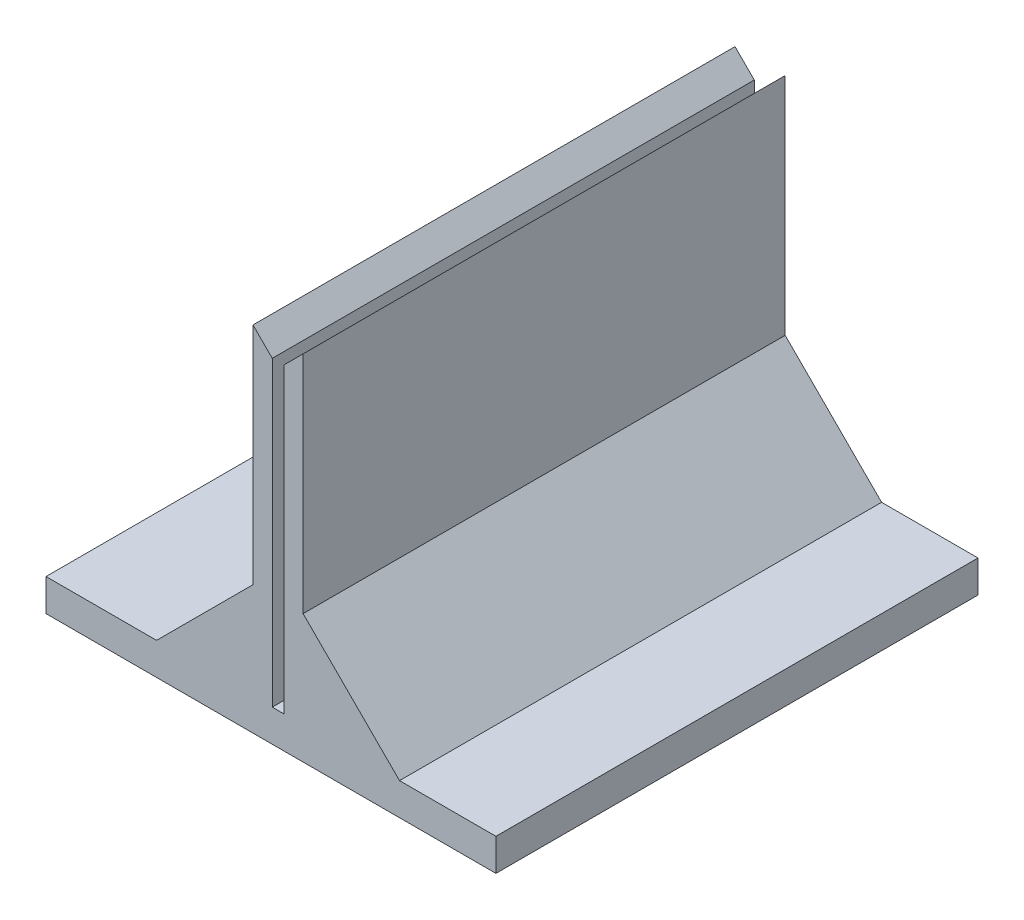
ISO-10303-21;
HEADER;
FILE_DESCRIPTION(('STEP AP214'),'2;1');
FILE_NAME('part.step','',(''),(''),'','','');
FILE_SCHEMA(('AUTOMOTIVE_DESIGN { 1 0 10303 214 1 1 1 1 }'));
ENDSEC;
DATA;
#1=APPLICATION_CONTEXT('core data for automotive mechanical design processes');
#2=APPLICATION_PROTOCOL_DEFINITION('international standard','automotive_design',2000,#1);
#3=PRODUCT_CONTEXT('',#1,'mechanical');
#4=PRODUCT('Part','Part','',(#3));
#5=PRODUCT_RELATED_PRODUCT_CATEGORY('part','',(#4));
#6=PRODUCT_DEFINITION_FORMATION('','',#4);
#7=PRODUCT_DEFINITION_CONTEXT('part definition',#1,'design');
#8=PRODUCT_DEFINITION('design','',#6,#7);
#9=PRODUCT_DEFINITION_SHAPE('','',#8);
#10=(LENGTH_UNIT() NAMED_UNIT(*) SI_UNIT(.MILLI.,.METRE.));
#11=(NAMED_UNIT(*) PLANE_ANGLE_UNIT() SI_UNIT($,.RADIAN.));
#12=(NAMED_UNIT(*) SI_UNIT($,.STERADIAN.) SOLID_ANGLE_UNIT());
#13=UNCERTAINTY_MEASURE_WITH_UNIT(LENGTH_MEASURE(1.E-05),#10,'distance_accuracy_value','');
#14=(GEOMETRIC_REPRESENTATION_CONTEXT(3) GLOBAL_UNCERTAINTY_ASSIGNED_CONTEXT((#13)) GLOBAL_UNIT_ASSIGNED_CONTEXT((#10,
#11,#12)) REPRESENTATION_CONTEXT('',''));
#15=CARTESIAN_POINT('',(0.,0.,0.));
#16=DIRECTION('',(0.,0.,1.));
#17=DIRECTION('',(1.,0.,0.));
#18=AXIS2_PLACEMENT_3D('',#15,#16,#17);
#19=CARTESIAN_POINT('',(0.,0.,75.));
#20=DIRECTION('',(1.,0.,0.));
#21=DIRECTION('',(0.,0.,-1.));
#22=AXIS2_PLACEMENT_3D('',#19,#20,#21);
#23=PLANE('',#22);
#24=DIRECTION('',(0.,-1.,0.));
#25=VECTOR('',#24,1.);
#26=CARTESIAN_POINT('',(0.,0.,0.));
#27=LINE('',#26,#25);
#28=CARTESIAN_POINT('',(0.,5.,0.));
#29=VERTEX_POINT('',#28);
#30=CARTESIAN_POINT('',(0.,0.,0.));
#31=VERTEX_POINT('',#30);
#32=EDGE_CURVE('E160',#29,#31,#27,.T.);
#33=ORIENTED_EDGE('',*,*,#32,.T.);
#34=DIRECTION('',(0.,0.,-1.));
#35=VECTOR('',#34,1.);
#36=CARTESIAN_POINT('',(0.,0.,75.));
#37=LINE('',#36,#35);
#38=CARTESIAN_POINT('',(0.,0.,75.));
#39=VERTEX_POINT('',#38);
#40=EDGE_CURVE('E141',#39,#31,#37,.T.);
#41=ORIENTED_EDGE('',*,*,#40,.F.);
#42=DIRECTION('',(0.,-1.,0.));
#43=VECTOR('',#42,1.);
#44=CARTESIAN_POINT('',(0.,0.,75.));
#45=LINE('',#44,#43);
#46=CARTESIAN_POINT('',(0.,5.,75.));
#47=VERTEX_POINT('',#46);
#48=EDGE_CURVE('E148',#47,#39,#45,.T.);
#49=ORIENTED_EDGE('',*,*,#48,.F.);
#50=DIRECTION('',(0.,0.,-1.));
#51=VECTOR('',#50,1.);
#52=CARTESIAN_POINT('',(0.,5.,75.));
#53=LINE('',#52,#51);
#54=EDGE_CURVE('E236',#47,#29,#53,.T.);
#55=ORIENTED_EDGE('',*,*,#54,.T.);
#56=EDGE_LOOP('',(#33,#41,#49,#55));
#57=FACE_BOUND('',#56,.T.);
#58=ADVANCED_FACE('F35',(#57),#23,.F.);
#59=CARTESIAN_POINT('',(0.,0.,75.));
#60=DIRECTION('',(0.,1.,0.));
#61=DIRECTION('',(0.,0.,1.));
#62=AXIS2_PLACEMENT_3D('',#59,#60,#61);
#63=PLANE('',#62);
#64=DIRECTION('',(1.,0.,0.));
#65=VECTOR('',#64,1.);
#66=CARTESIAN_POINT('',(0.,0.,0.));
#67=LINE('',#66,#65);
#68=CARTESIAN_POINT('',(70.,0.,0.));
#69=VERTEX_POINT('',#68);
#70=EDGE_CURVE('E271',#31,#69,#67,.T.);
#71=ORIENTED_EDGE('',*,*,#70,.T.);
#72=DIRECTION('',(0.,0.,-1.));
#73=VECTOR('',#72,1.);
#74=CARTESIAN_POINT('',(70.,0.,75.));
#75=LINE('',#74,#73);
#76=CARTESIAN_POINT('',(70.,0.,75.));
#77=VERTEX_POINT('',#76);
#78=EDGE_CURVE('E144',#77,#69,#75,.T.);
#79=ORIENTED_EDGE('',*,*,#78,.F.);
#80=DIRECTION('',(1.,0.,0.));
#81=VECTOR('',#80,1.);
#82=CARTESIAN_POINT('',(0.,0.,75.));
#83=LINE('',#82,#81);
#84=EDGE_CURVE('E137',#39,#77,#83,.T.);
#85=ORIENTED_EDGE('',*,*,#84,.F.);
#86=ORIENTED_EDGE('',*,*,#40,.T.);
#87=EDGE_LOOP('',(#71,#79,#85,#86));
#88=FACE_BOUND('',#87,.T.);
#89=ADVANCED_FACE('F139',(#88),#63,.F.);
#90=CARTESIAN_POINT('',(70.,0.,75.));
#91=DIRECTION('',(-1.,0.,0.));
#92=DIRECTION('',(0.,0.,1.));
#93=AXIS2_PLACEMENT_3D('',#90,#91,#92);
#94=PLANE('',#93);
#95=DIRECTION('',(0.,1.,0.));
#96=VECTOR('',#95,1.);
#97=CARTESIAN_POINT('',(70.,0.,0.));
#98=LINE('',#97,#96);
#99=CARTESIAN_POINT('',(70.,5.,0.));
#100=VERTEX_POINT('',#99);
#101=EDGE_CURVE('E225',#69,#100,#98,.T.);
#102=ORIENTED_EDGE('',*,*,#101,.T.);
#103=DIRECTION('',(0.,0.,-1.));
#104=VECTOR('',#103,1.);
#105=CARTESIAN_POINT('',(70.,5.,75.));
#106=LINE('',#105,#104);
#107=CARTESIAN_POINT('',(70.,5.,75.));
#108=VERTEX_POINT('',#107);
#109=EDGE_CURVE('E166',#108,#100,#106,.T.);
#110=ORIENTED_EDGE('',*,*,#109,.F.);
#111=DIRECTION('',(0.,1.,0.));
#112=VECTOR('',#111,1.);
#113=CARTESIAN_POINT('',(70.,0.,75.));
#114=LINE('',#113,#112);
#115=EDGE_CURVE('E147',#77,#108,#114,.T.);
#116=ORIENTED_EDGE('',*,*,#115,.F.);
#117=ORIENTED_EDGE('',*,*,#78,.T.);
#118=EDGE_LOOP('',(#102,#110,#116,#117));
#119=FACE_BOUND('',#118,.T.);
#120=ADVANCED_FACE('F272',(#119),#94,.F.);
#121=CARTESIAN_POINT('',(40.,5.,75.));
#122=DIRECTION('',(0.,-1.,0.));
#123=DIRECTION('',(0.,0.,-1.));
#124=AXIS2_PLACEMENT_3D('',#121,#122,#123);
#125=PLANE('',#124);
#126=DIRECTION('',(-1.,0.,0.));
#127=VECTOR('',#126,1.);
#128=CARTESIAN_POINT('',(40.,5.,0.));
#129=LINE('',#128,#127);
#130=CARTESIAN_POINT('',(54.9999999999999,5.,0.));
#131=VERTEX_POINT('',#130);
#132=EDGE_CURVE('E220',#100,#131,#129,.T.);
#133=ORIENTED_EDGE('',*,*,#132,.T.);
#134=DIRECTION('',(0.,0.,1.));
#135=VECTOR('',#134,1.);
#136=CARTESIAN_POINT('',(54.9999999999999,5.,75.));
#137=LINE('',#136,#135);
#138=CARTESIAN_POINT('',(54.9999999999999,5.,75.));
#139=VERTEX_POINT('',#138);
#140=EDGE_CURVE('E164',#131,#139,#137,.T.);
#141=ORIENTED_EDGE('',*,*,#140,.T.);
#142=DIRECTION('',(-1.,0.,0.));
#143=VECTOR('',#142,1.);
#144=CARTESIAN_POINT('',(40.,5.,75.));
#145=LINE('',#144,#143);
#146=EDGE_CURVE('E253',#108,#139,#145,.T.);
#147=ORIENTED_EDGE('',*,*,#146,.F.);
#148=ORIENTED_EDGE('',*,*,#109,.T.);
#149=EDGE_LOOP('',(#133,#141,#147,#148));
#150=FACE_BOUND('',#149,.T.);
#151=ADVANCED_FACE('F250',(#150),#125,.F.);
#152=CARTESIAN_POINT('',(40.,5.,75.));
#153=DIRECTION('',(-1.,0.,0.));
#154=DIRECTION('',(0.,0.,1.));
#155=AXIS2_PLACEMENT_3D('',#152,#153,#154);
#156=PLANE('',#155);
#157=DIRECTION('',(0.,1.,0.));
#158=VECTOR('',#157,1.);
#159=CARTESIAN_POINT('',(40.,5.,75.));
#160=LINE('',#159,#158);
#161=CARTESIAN_POINT('',(40.,20.0000000000001,75.));
#162=VERTEX_POINT('',#161);
#163=CARTESIAN_POINT('',(40.,55.,75.));
#164=VERTEX_POINT('',#163);
#165=EDGE_CURVE('E196',#162,#164,#160,.T.);
#166=ORIENTED_EDGE('',*,*,#165,.F.);
#167=DIRECTION('',(0.,0.,-1.));
#168=VECTOR('',#167,1.);
#169=CARTESIAN_POINT('',(40.,20.0000000000001,0.));
#170=LINE('',#169,#168);
#171=CARTESIAN_POINT('',(40.,20.0000000000001,0.));
#172=VERTEX_POINT('',#171);
#173=EDGE_CURVE('E161',#162,#172,#170,.T.);
#174=ORIENTED_EDGE('',*,*,#173,.T.);
#175=DIRECTION('',(0.,1.,0.));
#176=VECTOR('',#175,1.);
#177=CARTESIAN_POINT('',(40.,5.,0.));
#178=LINE('',#177,#176);
#179=CARTESIAN_POINT('',(40.,55.,0.));
#180=VERTEX_POINT('',#179);
#181=EDGE_CURVE('E214',#172,#180,#178,.T.);
#182=ORIENTED_EDGE('',*,*,#181,.T.);
#183=DIRECTION('',(0.,0.,-1.));
#184=VECTOR('',#183,1.);
#185=CARTESIAN_POINT('',(40.,55.,75.));
#186=LINE('',#185,#184);
#187=EDGE_CURVE('E210',#164,#180,#186,.T.);
#188=ORIENTED_EDGE('',*,*,#187,.F.);
#189=EDGE_LOOP('',(#166,#174,#182,#188));
#190=FACE_BOUND('',#189,.T.);
#191=ADVANCED_FACE('F218',(#190),#156,.F.);
#192=CARTESIAN_POINT('',(37.,5.,75.));
#193=DIRECTION('',(1.,0.,0.));
#194=DIRECTION('',(0.,0.,-1.));
#195=AXIS2_PLACEMENT_3D('',#192,#193,#194);
#196=PLANE('',#195);
#197=DIRECTION('',(0.,-1.,0.));
#198=VECTOR('',#197,1.);
#199=CARTESIAN_POINT('',(37.,5.,75.));
#200=LINE('',#199,#198);
#201=CARTESIAN_POINT('',(37.,52.,75.));
#202=VERTEX_POINT('',#201);
#203=CARTESIAN_POINT('',(37.,5.,75.));
#204=VERTEX_POINT('',#203);
#205=EDGE_CURVE('E193',#202,#204,#200,.T.);
#206=ORIENTED_EDGE('',*,*,#205,.F.);
#207=DIRECTION('',(0.,0.,-1.));
#208=VECTOR('',#207,1.);
#209=CARTESIAN_POINT('',(37.,52.,75.));
#210=LINE('',#209,#208);
#211=CARTESIAN_POINT('',(37.,52.,0.));
#212=VERTEX_POINT('',#211);
#213=EDGE_CURVE('E184',#202,#212,#210,.T.);
#214=ORIENTED_EDGE('',*,*,#213,.T.);
#215=DIRECTION('',(0.,-1.,0.));
#216=VECTOR('',#215,1.);
#217=CARTESIAN_POINT('',(37.,5.,0.));
#218=LINE('',#217,#216);
#219=CARTESIAN_POINT('',(37.,5.,0.));
#220=VERTEX_POINT('',#219);
#221=EDGE_CURVE('E216',#212,#220,#218,.T.);
#222=ORIENTED_EDGE('',*,*,#221,.T.);
#223=DIRECTION('',(0.,0.,-1.));
#224=VECTOR('',#223,1.);
#225=CARTESIAN_POINT('',(37.,5.,75.));
#226=LINE('',#225,#224);
#227=EDGE_CURVE('E205',#204,#220,#226,.T.);
#228=ORIENTED_EDGE('',*,*,#227,.F.);
#229=EDGE_LOOP('',(#206,#214,#222,#228));
#230=FACE_BOUND('',#229,.T.);
#231=ADVANCED_FACE('F202',(#230),#196,.F.);
#232=CARTESIAN_POINT('',(35.2,5.,75.));
#233=DIRECTION('',(0.,-1.,0.));
#234=DIRECTION('',(0.,0.,-1.));
#235=AXIS2_PLACEMENT_3D('',#232,#233,#234);
#236=PLANE('',#235);
#237=DIRECTION('',(-1.,0.,0.));
#238=VECTOR('',#237,1.);
#239=CARTESIAN_POINT('',(35.2,5.,0.));
#240=LINE('',#239,#238);
#241=CARTESIAN_POINT('',(35.2,5.,0.));
#242=VERTEX_POINT('',#241);
#243=EDGE_CURVE('E222',#220,#242,#240,.T.);
#244=ORIENTED_EDGE('',*,*,#243,.T.);
#245=DIRECTION('',(0.,0.,-1.));
#246=VECTOR('',#245,1.);
#247=CARTESIAN_POINT('',(35.2,5.,75.));
#248=LINE('',#247,#246);
#249=CARTESIAN_POINT('',(35.2,5.,75.));
#250=VERTEX_POINT('',#249);
#251=EDGE_CURVE('E241',#250,#242,#248,.T.);
#252=ORIENTED_EDGE('',*,*,#251,.F.);
#253=DIRECTION('',(-1.,0.,0.));
#254=VECTOR('',#253,1.);
#255=CARTESIAN_POINT('',(35.2,5.,75.));
#256=LINE('',#255,#254);
#257=EDGE_CURVE('E207',#204,#250,#256,.T.);
#258=ORIENTED_EDGE('',*,*,#257,.F.);
#259=ORIENTED_EDGE('',*,*,#227,.T.);
#260=EDGE_LOOP('',(#244,#252,#258,#259));
#261=FACE_BOUND('',#260,.T.);
#262=ADVANCED_FACE('F331',(#261),#236,.F.);
#263=CARTESIAN_POINT('',(35.2,55.,75.));
#264=DIRECTION('',(-1.,0.,0.));
#265=DIRECTION('',(0.,-1.,0.));
#266=AXIS2_PLACEMENT_3D('',#263,#264,#265);
#267=PLANE('',#266);
#268=DIRECTION('',(0.,1.,0.));
#269=VECTOR('',#268,1.);
#270=CARTESIAN_POINT('',(35.2,55.,0.));
#271=LINE('',#270,#269);
#272=CARTESIAN_POINT('',(35.2,52.,0.));
#273=VERTEX_POINT('',#272);
#274=EDGE_CURVE('E230',#242,#273,#271,.T.);
#275=ORIENTED_EDGE('',*,*,#274,.T.);
#276=DIRECTION('',(0.,0.,1.));
#277=VECTOR('',#276,1.);
#278=CARTESIAN_POINT('',(35.2,52.,75.));
#279=LINE('',#278,#277);
#280=CARTESIAN_POINT('',(35.2,52.,75.));
#281=VERTEX_POINT('',#280);
#282=EDGE_CURVE('E11',#273,#281,#279,.T.);
#283=ORIENTED_EDGE('',*,*,#282,.T.);
#284=DIRECTION('',(0.,1.,0.));
#285=VECTOR('',#284,1.);
#286=CARTESIAN_POINT('',(35.2,55.,75.));
#287=LINE('',#286,#285);
#288=EDGE_CURVE('E264',#250,#281,#287,.T.);
#289=ORIENTED_EDGE('',*,*,#288,.F.);
#290=ORIENTED_EDGE('',*,*,#251,.T.);
#291=EDGE_LOOP('',(#275,#283,#289,#290));
#292=FACE_BOUND('',#291,.T.);
#293=ADVANCED_FACE('F325',(#292),#267,.F.);
#294=CARTESIAN_POINT('',(32.2,55.,75.));
#295=DIRECTION('',(1.,0.,0.));
#296=DIRECTION('',(0.,1.,0.));
#297=AXIS2_PLACEMENT_3D('',#294,#295,#296);
#298=PLANE('',#297);
#299=DIRECTION('',(0.,-1.,0.));
#300=VECTOR('',#299,1.);
#301=CARTESIAN_POINT('',(32.2,55.,0.));
#302=LINE('',#301,#300);
#303=CARTESIAN_POINT('',(32.2,55.,0.));
#304=VERTEX_POINT('',#303);
#305=CARTESIAN_POINT('',(32.2,20.,0.));
#306=VERTEX_POINT('',#305);
#307=EDGE_CURVE('E232',#304,#306,#302,.T.);
#308=ORIENTED_EDGE('',*,*,#307,.T.);
#309=DIRECTION('',(0.,0.,1.));
#310=VECTOR('',#309,1.);
#311=CARTESIAN_POINT('',(32.2,20.,75.));
#312=LINE('',#311,#310);
#313=CARTESIAN_POINT('',(32.2,20.,75.));
#314=VERTEX_POINT('',#313);
#315=EDGE_CURVE('E174',#306,#314,#312,.T.);
#316=ORIENTED_EDGE('',*,*,#315,.T.);
#317=DIRECTION('',(0.,-1.,0.));
#318=VECTOR('',#317,1.);
#319=CARTESIAN_POINT('',(32.2,55.,75.));
#320=LINE('',#319,#318);
#321=CARTESIAN_POINT('',(32.2,55.,75.));
#322=VERTEX_POINT('',#321);
#323=EDGE_CURVE('E266',#322,#314,#320,.T.);
#324=ORIENTED_EDGE('',*,*,#323,.F.);
#325=DIRECTION('',(0.,0.,-1.));
#326=VECTOR('',#325,1.);
#327=CARTESIAN_POINT('',(32.2,55.,75.));
#328=LINE('',#327,#326);
#329=EDGE_CURVE('E238',#322,#304,#328,.T.);
#330=ORIENTED_EDGE('',*,*,#329,.T.);
#331=EDGE_LOOP('',(#308,#316,#324,#330));
#332=FACE_BOUND('',#331,.T.);
#333=ADVANCED_FACE('F312',(#332),#298,.F.);
#334=CARTESIAN_POINT('',(0.,5.,75.));
#335=DIRECTION('',(0.,-1.,0.));
#336=DIRECTION('',(1.,0.,0.));
#337=AXIS2_PLACEMENT_3D('',#334,#335,#336);
#338=PLANE('',#337);
#339=DIRECTION('',(-1.,0.,0.));
#340=VECTOR('',#339,1.);
#341=CARTESIAN_POINT('',(0.,5.,75.));
#342=LINE('',#341,#340);
#343=CARTESIAN_POINT('',(17.1999999999999,5.,75.));
#344=VERTEX_POINT('',#343);
#345=EDGE_CURVE('E153',#344,#47,#342,.T.);
#346=ORIENTED_EDGE('',*,*,#345,.F.);
#347=DIRECTION('',(0.,0.,-1.));
#348=VECTOR('',#347,1.);
#349=CARTESIAN_POINT('',(17.1999999999999,5.,0.));
#350=LINE('',#349,#348);
#351=CARTESIAN_POINT('',(17.1999999999999,5.,0.));
#352=VERTEX_POINT('',#351);
#353=EDGE_CURVE('E171',#344,#352,#350,.T.);
#354=ORIENTED_EDGE('',*,*,#353,.T.);
#355=DIRECTION('',(-1.,0.,0.));
#356=VECTOR('',#355,1.);
#357=CARTESIAN_POINT('',(0.,5.,0.));
#358=LINE('',#357,#356);
#359=EDGE_CURVE('E157',#352,#29,#358,.T.);
#360=ORIENTED_EDGE('',*,*,#359,.T.);
#361=ORIENTED_EDGE('',*,*,#54,.F.);
#362=EDGE_LOOP('',(#346,#354,#360,#361));
#363=FACE_BOUND('',#362,.T.);
#364=ADVANCED_FACE('F316',(#363),#338,.F.);
#365=CARTESIAN_POINT('',(0.,0.,75.));
#366=DIRECTION('',(0.,0.,-1.));
#367=DIRECTION('',(-1.,0.,0.));
#368=AXIS2_PLACEMENT_3D('',#365,#366,#367);
#369=PLANE('',#368);
#370=ORIENTED_EDGE('',*,*,#165,.T.);
#371=DIRECTION('',(0.707106781186549,0.707106781186546,0.));
#372=VECTOR('',#371,1.);
#373=CARTESIAN_POINT('',(37.,52.,75.));
#374=LINE('',#373,#372);
#375=EDGE_CURVE('E44',#164,#202,#374,.F.);
#376=ORIENTED_EDGE('',*,*,#375,.T.);
#377=ORIENTED_EDGE('',*,*,#205,.T.);
#378=ORIENTED_EDGE('',*,*,#257,.T.);
#379=ORIENTED_EDGE('',*,*,#288,.T.);
#380=DIRECTION('',(0.707106781186548,-0.707106781186548,0.));
#381=VECTOR('',#380,1.);
#382=CARTESIAN_POINT('',(32.2,55.,75.));
#383=LINE('',#382,#381);
#384=EDGE_CURVE('E190',#281,#322,#383,.F.);
#385=ORIENTED_EDGE('',*,*,#384,.T.);
#386=ORIENTED_EDGE('',*,*,#323,.T.);
#387=DIRECTION('',(0.707106781186551,0.707106781186544,0.));
#388=VECTOR('',#387,1.);
#389=CARTESIAN_POINT('',(6.09999999999985,-6.09999999999991,75.));
#390=LINE('',#389,#388);
#391=EDGE_CURVE('E182',#314,#344,#390,.F.);
#392=ORIENTED_EDGE('',*,*,#391,.T.);
#393=ORIENTED_EDGE('',*,*,#345,.T.);
#394=ORIENTED_EDGE('',*,*,#48,.T.);
#395=ORIENTED_EDGE('',*,*,#84,.T.);
#396=ORIENTED_EDGE('',*,*,#115,.T.);
#397=ORIENTED_EDGE('',*,*,#146,.T.);
#398=DIRECTION('',(0.707106781186544,-0.707106781186551,0.));
#399=VECTOR('',#398,1.);
#400=CARTESIAN_POINT('',(30.0000000000003,29.9999999999999,75.));
#401=LINE('',#400,#399);
#402=EDGE_CURVE('E178',#139,#162,#401,.F.);
#403=ORIENTED_EDGE('',*,*,#402,.T.);
#404=EDGE_LOOP('',(#370,#376,#377,#378,#379,#385,#386,#392,#393,#394,#395,#396,#397,#403));
#405=FACE_BOUND('',#404,.T.);
#406=ADVANCED_FACE('F151',(#405),#369,.F.);
#407=CARTESIAN_POINT('',(0.,0.,0.));
#408=DIRECTION('',(0.,0.,-1.));
#409=DIRECTION('',(-1.,0.,0.));
#410=AXIS2_PLACEMENT_3D('',#407,#408,#409);
#411=PLANE('',#410);
#412=ORIENTED_EDGE('',*,*,#221,.F.);
#413=DIRECTION('',(-0.707106781186549,-0.707106781186546,0.));
#414=VECTOR('',#413,1.);
#415=CARTESIAN_POINT('',(-7.50000000000008,7.50000000000012,0.));
#416=LINE('',#415,#414);
#417=EDGE_CURVE('E188',#212,#180,#416,.F.);
#418=ORIENTED_EDGE('',*,*,#417,.T.);
#419=ORIENTED_EDGE('',*,*,#181,.F.);
#420=DIRECTION('',(-0.707106781186544,0.707106781186551,0.));
#421=VECTOR('',#420,1.);
#422=CARTESIAN_POINT('',(40.,20.0000000000001,0.));
#423=LINE('',#422,#421);
#424=EDGE_CURVE('E176',#172,#131,#423,.F.);
#425=ORIENTED_EDGE('',*,*,#424,.T.);
#426=ORIENTED_EDGE('',*,*,#132,.F.);
#427=ORIENTED_EDGE('',*,*,#101,.F.);
#428=ORIENTED_EDGE('',*,*,#70,.F.);
#429=ORIENTED_EDGE('',*,*,#32,.F.);
#430=ORIENTED_EDGE('',*,*,#359,.F.);
#431=DIRECTION('',(-0.707106781186551,-0.707106781186544,0.));
#432=VECTOR('',#431,1.);
#433=CARTESIAN_POINT('',(17.1999999999999,5.,0.));
#434=LINE('',#433,#432);
#435=EDGE_CURVE('E180',#352,#306,#434,.F.);
#436=ORIENTED_EDGE('',*,*,#435,.T.);
#437=ORIENTED_EDGE('',*,*,#307,.F.);
#438=DIRECTION('',(-0.707106781186548,0.707106781186548,0.));
#439=VECTOR('',#438,1.);
#440=CARTESIAN_POINT('',(43.6,43.6,0.));
#441=LINE('',#440,#439);
#442=EDGE_CURVE('E57',#304,#273,#441,.F.);
#443=ORIENTED_EDGE('',*,*,#442,.T.);
#444=ORIENTED_EDGE('',*,*,#274,.F.);
#445=ORIENTED_EDGE('',*,*,#243,.F.);
#446=EDGE_LOOP('',(#412,#418,#419,#425,#426,#427,#428,#429,#430,#436,#437,#443,#444,#445));
#447=FACE_BOUND('',#446,.T.);
#448=ADVANCED_FACE('F213',(#447),#411,.T.);
#449=CARTESIAN_POINT('',(40.,20.0000000000001,75.));
#450=DIRECTION('',(0.707106781186551,0.707106781186544,0.));
#451=DIRECTION('',(0.,0.,1.));
#452=AXIS2_PLACEMENT_3D('',#449,#450,#451);
#453=PLANE('',#452);
#454=ORIENTED_EDGE('',*,*,#402,.F.);
#455=ORIENTED_EDGE('',*,*,#140,.F.);
#456=ORIENTED_EDGE('',*,*,#424,.F.);
#457=ORIENTED_EDGE('',*,*,#173,.F.);
#458=EDGE_LOOP('',(#454,#455,#456,#457));
#459=FACE_BOUND('',#458,.T.);
#460=ADVANCED_FACE('F258',(#459),#453,.T.);
#461=CARTESIAN_POINT('',(17.1999999999999,5.,75.));
#462=DIRECTION('',(-0.707106781186544,0.707106781186551,0.));
#463=DIRECTION('',(0.,0.,1.));
#464=AXIS2_PLACEMENT_3D('',#461,#462,#463);
#465=PLANE('',#464);
#466=ORIENTED_EDGE('',*,*,#391,.F.);
#467=ORIENTED_EDGE('',*,*,#315,.F.);
#468=ORIENTED_EDGE('',*,*,#435,.F.);
#469=ORIENTED_EDGE('',*,*,#353,.F.);
#470=EDGE_LOOP('',(#466,#467,#468,#469));
#471=FACE_BOUND('',#470,.T.);
#472=ADVANCED_FACE('F292',(#471),#465,.T.);
#473=CARTESIAN_POINT('',(37.,52.,75.));
#474=DIRECTION('',(0.707106781186546,-0.707106781186549,0.));
#475=DIRECTION('',(0.,0.,-1.));
#476=AXIS2_PLACEMENT_3D('',#473,#474,#475);
#477=PLANE('',#476);
#478=ORIENTED_EDGE('',*,*,#375,.F.);
#479=ORIENTED_EDGE('',*,*,#187,.T.);
#480=ORIENTED_EDGE('',*,*,#417,.F.);
#481=ORIENTED_EDGE('',*,*,#213,.F.);
#482=EDGE_LOOP('',(#478,#479,#480,#481));
#483=FACE_BOUND('',#482,.T.);
#484=ADVANCED_FACE('F209',(#483),#477,.F.);
#485=CARTESIAN_POINT('',(32.2,55.,75.));
#486=DIRECTION('',(-0.707106781186548,-0.707106781186548,0.));
#487=DIRECTION('',(0.,0.,-1.));
#488=AXIS2_PLACEMENT_3D('',#485,#486,#487);
#489=PLANE('',#488);
#490=ORIENTED_EDGE('',*,*,#384,.F.);
#491=ORIENTED_EDGE('',*,*,#282,.F.);
#492=ORIENTED_EDGE('',*,*,#442,.F.);
#493=ORIENTED_EDGE('',*,*,#329,.F.);
#494=EDGE_LOOP('',(#490,#491,#492,#493));
#495=FACE_BOUND('',#494,.T.);
#496=ADVANCED_FACE('F38',(#495),#489,.F.);
#497=CLOSED_SHELL('',(#58,#89,#120,#151,#191,#231,#262,#293,#333,#364,#406,#448,#460,#472,#484,#496));
#498=MANIFOLD_SOLID_BREP('B2',#497);
#499=ADVANCED_BREP_SHAPE_REPRESENTATION('',(#18,#498),#14);
#500=SHAPE_DEFINITION_REPRESENTATION(#9,#499);
ENDSEC;
END-ISO-10303-21;
